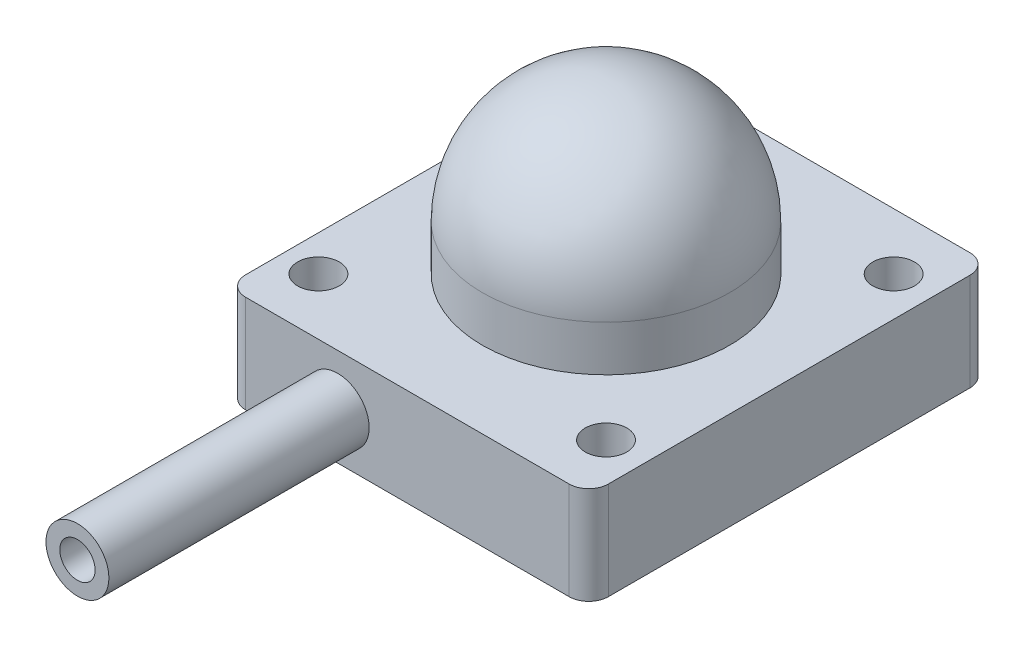
ISO-10303-21;
HEADER;
FILE_DESCRIPTION(('STEP AP214'),'2;1');
FILE_NAME('part.step','',(''),(''),'','','');
FILE_SCHEMA(('AUTOMOTIVE_DESIGN { 1 0 10303 214 1 1 1 1 }'));
ENDSEC;
DATA;
#1=APPLICATION_CONTEXT('core data for automotive mechanical design processes');
#2=APPLICATION_PROTOCOL_DEFINITION('international standard','automotive_design',2000,#1);
#3=PRODUCT_CONTEXT('',#1,'mechanical');
#4=PRODUCT('Part','Part','',(#3));
#5=PRODUCT_RELATED_PRODUCT_CATEGORY('part','',(#4));
#6=PRODUCT_DEFINITION_FORMATION('','',#4);
#7=PRODUCT_DEFINITION_CONTEXT('part definition',#1,'design');
#8=PRODUCT_DEFINITION('design','',#6,#7);
#9=PRODUCT_DEFINITION_SHAPE('','',#8);
#10=(LENGTH_UNIT() NAMED_UNIT(*) SI_UNIT(.MILLI.,.METRE.));
#11=(NAMED_UNIT(*) PLANE_ANGLE_UNIT() SI_UNIT($,.RADIAN.));
#12=(NAMED_UNIT(*) SI_UNIT($,.STERADIAN.) SOLID_ANGLE_UNIT());
#13=UNCERTAINTY_MEASURE_WITH_UNIT(LENGTH_MEASURE(1.E-05),#10,'distance_accuracy_value','');
#14=(GEOMETRIC_REPRESENTATION_CONTEXT(3) GLOBAL_UNCERTAINTY_ASSIGNED_CONTEXT((#13)) GLOBAL_UNIT_ASSIGNED_CONTEXT((#10,
#11,#12)) REPRESENTATION_CONTEXT('',''));
#15=CARTESIAN_POINT('',(0.,0.,0.));
#16=DIRECTION('',(0.,0.,1.));
#17=DIRECTION('',(1.,0.,0.));
#18=AXIS2_PLACEMENT_3D('',#15,#16,#17);
#19=CARTESIAN_POINT('',(0.,7.5,0.));
#20=DIRECTION('',(0.,-1.,0.));
#21=DIRECTION('',(0.,0.,-1.));
#22=AXIS2_PLACEMENT_3D('',#19,#20,#21);
#23=PLANE('',#22);
#24=CARTESIAN_POINT('',(0.,7.5,0.));
#25=DIRECTION('',(0.,1.,0.));
#26=DIRECTION('',(0.,0.,1.));
#27=AXIS2_PLACEMENT_3D('',#24,#25,#26);
#28=CIRCLE('',#27,9.5);
#29=CARTESIAN_POINT('',(0.,7.5,9.5));
#30=VERTEX_POINT('',#29);
#31=EDGE_CURVE('E160',#30,#30,#28,.T.);
#32=ORIENTED_EDGE('',*,*,#31,.F.);
#33=EDGE_LOOP('',(#32));
#34=FACE_BOUND('',#33,.T.);
#35=DIRECTION('',(-1.,0.,0.));
#36=VECTOR('',#35,1.);
#37=CARTESIAN_POINT('',(-13.7914684254667,7.5,-15.39627153565));
#38=LINE('',#37,#36);
#39=CARTESIAN_POINT('',(12.5689272987327,7.5,-15.39627153565));
#40=VERTEX_POINT('',#39);
#41=CARTESIAN_POINT('',(-12.2914684254667,7.5,-15.39627153565));
#42=VERTEX_POINT('',#41);
#43=EDGE_CURVE('E151',#40,#42,#38,.T.);
#44=ORIENTED_EDGE('',*,*,#43,.T.);
#45=CARTESIAN_POINT('',(-12.2914684254667,7.5,-13.89627153565));
#46=DIRECTION('',(0.,-1.,0.));
#47=DIRECTION('',(0.,0.,-1.));
#48=AXIS2_PLACEMENT_3D('',#45,#46,#47);
#49=CIRCLE('',#48,1.5);
#50=CARTESIAN_POINT('',(-13.7914684254667,7.5,-13.89627153565));
#51=VERTEX_POINT('',#50);
#52=EDGE_CURVE('E182',#42,#51,#49,.F.);
#53=ORIENTED_EDGE('',*,*,#52,.T.);
#54=DIRECTION('',(0.,0.,1.));
#55=VECTOR('',#54,1.);
#56=CARTESIAN_POINT('',(-13.7914684254667,7.5,15.39627153565));
#57=LINE('',#56,#55);
#58=CARTESIAN_POINT('',(-13.7914684254667,7.5,13.89627153565));
#59=VERTEX_POINT('',#58);
#60=EDGE_CURVE('E130',#51,#59,#57,.T.);
#61=ORIENTED_EDGE('',*,*,#60,.T.);
#62=CARTESIAN_POINT('',(-12.2914684254667,7.5,13.89627153565));
#63=DIRECTION('',(0.,-1.,0.));
#64=DIRECTION('',(0.,0.,-1.));
#65=AXIS2_PLACEMENT_3D('',#62,#63,#64);
#66=CIRCLE('',#65,1.5);
#67=CARTESIAN_POINT('',(-12.2914684254667,7.5,15.39627153565));
#68=VERTEX_POINT('',#67);
#69=EDGE_CURVE('E174',#59,#68,#66,.F.);
#70=ORIENTED_EDGE('',*,*,#69,.T.);
#71=DIRECTION('',(1.,0.,0.));
#72=VECTOR('',#71,1.);
#73=CARTESIAN_POINT('',(14.0689272987327,7.5,15.39627153565));
#74=LINE('',#73,#72);
#75=CARTESIAN_POINT('',(12.5689272987327,7.5,15.39627153565));
#76=VERTEX_POINT('',#75);
#77=EDGE_CURVE('E199',#68,#76,#74,.T.);
#78=ORIENTED_EDGE('',*,*,#77,.T.);
#79=CARTESIAN_POINT('',(12.5689272987327,7.5,13.89627153565));
#80=DIRECTION('',(0.,-1.,0.));
#81=DIRECTION('',(0.,0.,-1.));
#82=AXIS2_PLACEMENT_3D('',#79,#80,#81);
#83=CIRCLE('',#82,1.5);
#84=CARTESIAN_POINT('',(14.0689272987327,7.5,13.89627153565));
#85=VERTEX_POINT('',#84);
#86=EDGE_CURVE('E64',#76,#85,#83,.F.);
#87=ORIENTED_EDGE('',*,*,#86,.T.);
#88=DIRECTION('',(0.,0.,-1.));
#89=VECTOR('',#88,1.);
#90=CARTESIAN_POINT('',(14.0689272987327,7.5,-15.39627153565));
#91=LINE('',#90,#89);
#92=CARTESIAN_POINT('',(14.0689272987327,7.5,-13.89627153565));
#93=VERTEX_POINT('',#92);
#94=EDGE_CURVE('E206',#85,#93,#91,.T.);
#95=ORIENTED_EDGE('',*,*,#94,.T.);
#96=CARTESIAN_POINT('',(12.5689272987327,7.5,-13.89627153565));
#97=DIRECTION('',(0.,-1.,0.));
#98=DIRECTION('',(0.,0.,-1.));
#99=AXIS2_PLACEMENT_3D('',#96,#97,#98);
#100=CIRCLE('',#99,1.5);
#101=EDGE_CURVE('E179',#93,#40,#100,.F.);
#102=ORIENTED_EDGE('',*,*,#101,.T.);
#103=EDGE_LOOP('',(#44,#53,#61,#70,#78,#87,#95,#102));
#104=FACE_BOUND('',#103,.T.);
#105=CARTESIAN_POINT('',(-11.05,7.5,-11.05));
#106=DIRECTION('',(0.,1.,0.));
#107=DIRECTION('',(0.,0.,1.));
#108=AXIS2_PLACEMENT_3D('',#105,#106,#107);
#109=CIRCLE('',#108,1.6);
#110=CARTESIAN_POINT('',(-11.05,7.5,-9.44999999999999));
#111=VERTEX_POINT('',#110);
#112=EDGE_CURVE('E140',#111,#111,#109,.T.);
#113=ORIENTED_EDGE('',*,*,#112,.F.);
#114=EDGE_LOOP('',(#113));
#115=FACE_BOUND('',#114,.T.);
#116=CARTESIAN_POINT('',(11.05,7.5,-11.05));
#117=DIRECTION('',(0.,1.,0.));
#118=DIRECTION('',(0.,0.,1.));
#119=AXIS2_PLACEMENT_3D('',#116,#117,#118);
#120=CIRCLE('',#119,1.6);
#121=CARTESIAN_POINT('',(11.05,7.5,-9.44999999999999));
#122=VERTEX_POINT('',#121);
#123=EDGE_CURVE('E229',#122,#122,#120,.T.);
#124=ORIENTED_EDGE('',*,*,#123,.F.);
#125=EDGE_LOOP('',(#124));
#126=FACE_BOUND('',#125,.T.);
#127=CARTESIAN_POINT('',(-11.05,7.5,11.05));
#128=DIRECTION('',(0.,1.,0.));
#129=DIRECTION('',(0.,0.,-1.));
#130=AXIS2_PLACEMENT_3D('',#127,#128,#129);
#131=CIRCLE('',#130,1.6);
#132=CARTESIAN_POINT('',(-11.05,7.5,9.45));
#133=VERTEX_POINT('',#132);
#134=EDGE_CURVE('E235',#133,#133,#131,.T.);
#135=ORIENTED_EDGE('',*,*,#134,.F.);
#136=EDGE_LOOP('',(#135));
#137=FACE_BOUND('',#136,.T.);
#138=CARTESIAN_POINT('',(11.05,7.5,11.05));
#139=DIRECTION('',(0.,1.,0.));
#140=DIRECTION('',(0.,0.,-1.));
#141=AXIS2_PLACEMENT_3D('',#138,#139,#140);
#142=CIRCLE('',#141,1.6);
#143=CARTESIAN_POINT('',(11.05,7.5,9.44999999999999));
#144=VERTEX_POINT('',#143);
#145=EDGE_CURVE('E243',#144,#144,#142,.T.);
#146=ORIENTED_EDGE('',*,*,#145,.F.);
#147=EDGE_LOOP('',(#146));
#148=FACE_BOUND('',#147,.T.);
#149=ADVANCED_FACE('F41',(#34,#104,#115,#126,#137,#148),#23,.F.);
#150=CARTESIAN_POINT('',(0.,0.,0.));
#151=DIRECTION('',(0.,-1.,0.));
#152=DIRECTION('',(0.,0.,-1.));
#153=AXIS2_PLACEMENT_3D('',#150,#151,#152);
#154=PLANE('',#153);
#155=CARTESIAN_POINT('',(-11.05,0.,11.05));
#156=DIRECTION('',(0.,1.,0.));
#157=DIRECTION('',(0.,0.,-1.));
#158=AXIS2_PLACEMENT_3D('',#155,#156,#157);
#159=CIRCLE('',#158,1.6);
#160=CARTESIAN_POINT('',(-11.05,0.,9.45));
#161=VERTEX_POINT('',#160);
#162=EDGE_CURVE('E239',#161,#161,#159,.T.);
#163=ORIENTED_EDGE('',*,*,#162,.T.);
#164=EDGE_LOOP('',(#163));
#165=FACE_BOUND('',#164,.T.);
#166=CARTESIAN_POINT('',(-11.05,0.,-11.05));
#167=DIRECTION('',(0.,1.,0.));
#168=DIRECTION('',(0.,0.,1.));
#169=AXIS2_PLACEMENT_3D('',#166,#167,#168);
#170=CIRCLE('',#169,1.6);
#171=CARTESIAN_POINT('',(-11.05,0.,-9.44999999999999));
#172=VERTEX_POINT('',#171);
#173=EDGE_CURVE('E148',#172,#172,#170,.T.);
#174=ORIENTED_EDGE('',*,*,#173,.T.);
#175=EDGE_LOOP('',(#174));
#176=FACE_BOUND('',#175,.T.);
#177=DIRECTION('',(0.,0.,1.));
#178=VECTOR('',#177,1.);
#179=CARTESIAN_POINT('',(-13.7914684254667,0.,15.39627153565));
#180=LINE('',#179,#178);
#181=CARTESIAN_POINT('',(-13.7914684254667,0.,-13.89627153565));
#182=VERTEX_POINT('',#181);
#183=CARTESIAN_POINT('',(-13.7914684254667,0.,13.89627153565));
#184=VERTEX_POINT('',#183);
#185=EDGE_CURVE('E127',#182,#184,#180,.T.);
#186=ORIENTED_EDGE('',*,*,#185,.F.);
#187=CARTESIAN_POINT('',(-12.2914684254667,0.,-13.89627153565));
#188=DIRECTION('',(0.,-1.,0.));
#189=DIRECTION('',(0.,0.,-1.));
#190=AXIS2_PLACEMENT_3D('',#187,#188,#189);
#191=CIRCLE('',#190,1.5);
#192=CARTESIAN_POINT('',(-12.2914684254667,0.,-15.39627153565));
#193=VERTEX_POINT('',#192);
#194=EDGE_CURVE('E109',#182,#193,#191,.T.);
#195=ORIENTED_EDGE('',*,*,#194,.T.);
#196=DIRECTION('',(-1.,0.,0.));
#197=VECTOR('',#196,1.);
#198=CARTESIAN_POINT('',(-13.7914684254667,0.,-15.39627153565));
#199=LINE('',#198,#197);
#200=CARTESIAN_POINT('',(12.5689272987327,0.,-15.39627153565));
#201=VERTEX_POINT('',#200);
#202=EDGE_CURVE('E156',#201,#193,#199,.T.);
#203=ORIENTED_EDGE('',*,*,#202,.F.);
#204=CARTESIAN_POINT('',(12.5689272987327,0.,-13.89627153565));
#205=DIRECTION('',(0.,-1.,0.));
#206=DIRECTION('',(0.,0.,-1.));
#207=AXIS2_PLACEMENT_3D('',#204,#205,#206);
#208=CIRCLE('',#207,1.5);
#209=CARTESIAN_POINT('',(14.0689272987327,0.,-13.89627153565));
#210=VERTEX_POINT('',#209);
#211=EDGE_CURVE('E121',#201,#210,#208,.T.);
#212=ORIENTED_EDGE('',*,*,#211,.T.);
#213=DIRECTION('',(0.,0.,-1.));
#214=VECTOR('',#213,1.);
#215=CARTESIAN_POINT('',(14.0689272987327,0.,-15.39627153565));
#216=LINE('',#215,#214);
#217=CARTESIAN_POINT('',(14.0689272987327,0.,13.89627153565));
#218=VERTEX_POINT('',#217);
#219=EDGE_CURVE('E145',#218,#210,#216,.T.);
#220=ORIENTED_EDGE('',*,*,#219,.F.);
#221=CARTESIAN_POINT('',(12.5689272987327,0.,13.89627153565));
#222=DIRECTION('',(0.,-1.,0.));
#223=DIRECTION('',(0.,0.,-1.));
#224=AXIS2_PLACEMENT_3D('',#221,#222,#223);
#225=CIRCLE('',#224,1.5);
#226=CARTESIAN_POINT('',(12.5689272987327,0.,15.39627153565));
#227=VERTEX_POINT('',#226);
#228=EDGE_CURVE('E164',#218,#227,#225,.T.);
#229=ORIENTED_EDGE('',*,*,#228,.T.);
#230=DIRECTION('',(1.,0.,0.));
#231=VECTOR('',#230,1.);
#232=CARTESIAN_POINT('',(14.0689272987327,0.,15.39627153565));
#233=LINE('',#232,#231);
#234=CARTESIAN_POINT('',(-12.2914684254667,0.,15.39627153565));
#235=VERTEX_POINT('',#234);
#236=EDGE_CURVE('E139',#235,#227,#233,.T.);
#237=ORIENTED_EDGE('',*,*,#236,.F.);
#238=CARTESIAN_POINT('',(-12.2914684254667,0.,13.89627153565));
#239=DIRECTION('',(0.,-1.,0.));
#240=DIRECTION('',(0.,0.,-1.));
#241=AXIS2_PLACEMENT_3D('',#238,#239,#240);
#242=CIRCLE('',#241,1.5);
#243=EDGE_CURVE('E132',#235,#184,#242,.T.);
#244=ORIENTED_EDGE('',*,*,#243,.T.);
#245=EDGE_LOOP('',(#186,#195,#203,#212,#220,#229,#237,#244));
#246=FACE_BOUND('',#245,.T.);
#247=CARTESIAN_POINT('',(11.05,0.,-11.05));
#248=DIRECTION('',(0.,1.,0.));
#249=DIRECTION('',(0.,0.,1.));
#250=AXIS2_PLACEMENT_3D('',#247,#248,#249);
#251=CIRCLE('',#250,1.6);
#252=CARTESIAN_POINT('',(11.05,0.,-9.44999999999999));
#253=VERTEX_POINT('',#252);
#254=EDGE_CURVE('E231',#253,#253,#251,.T.);
#255=ORIENTED_EDGE('',*,*,#254,.T.);
#256=EDGE_LOOP('',(#255));
#257=FACE_BOUND('',#256,.T.);
#258=CARTESIAN_POINT('',(11.05,0.,11.05));
#259=DIRECTION('',(0.,1.,0.));
#260=DIRECTION('',(0.,0.,-1.));
#261=AXIS2_PLACEMENT_3D('',#258,#259,#260);
#262=CIRCLE('',#261,1.6);
#263=CARTESIAN_POINT('',(11.05,0.,9.44999999999999));
#264=VERTEX_POINT('',#263);
#265=EDGE_CURVE('E247',#264,#264,#262,.T.);
#266=ORIENTED_EDGE('',*,*,#265,.T.);
#267=EDGE_LOOP('',(#266));
#268=FACE_BOUND('',#267,.T.);
#269=ADVANCED_FACE('F135',(#165,#176,#246,#257,#268),#154,.T.);
#270=CARTESIAN_POINT('',(-13.7914684254667,7.5,15.39627153565));
#271=DIRECTION('',(1.,0.,0.));
#272=DIRECTION('',(0.,0.,-1.));
#273=AXIS2_PLACEMENT_3D('',#270,#271,#272);
#274=PLANE('',#273);
#275=ORIENTED_EDGE('',*,*,#60,.F.);
#276=DIRECTION('',(0.,-1.,0.));
#277=VECTOR('',#276,1.);
#278=CARTESIAN_POINT('',(-13.7914684254667,7.5,-13.89627153565));
#279=LINE('',#278,#277);
#280=EDGE_CURVE('E113',#51,#182,#279,.T.);
#281=ORIENTED_EDGE('',*,*,#280,.T.);
#282=ORIENTED_EDGE('',*,*,#185,.T.);
#283=DIRECTION('',(0.,-1.,0.));
#284=VECTOR('',#283,1.);
#285=CARTESIAN_POINT('',(-13.7914684254667,7.5,13.89627153565));
#286=LINE('',#285,#284);
#287=EDGE_CURVE('E133',#184,#59,#286,.F.);
#288=ORIENTED_EDGE('',*,*,#287,.T.);
#289=EDGE_LOOP('',(#275,#281,#282,#288));
#290=FACE_BOUND('',#289,.T.);
#291=ADVANCED_FACE('F126',(#290),#274,.F.);
#292=CARTESIAN_POINT('',(14.0689272987327,7.5,15.39627153565));
#293=DIRECTION('',(0.,0.,-1.));
#294=DIRECTION('',(-1.,0.,0.));
#295=AXIS2_PLACEMENT_3D('',#292,#293,#294);
#296=PLANE('',#295);
#297=CARTESIAN_POINT('',(-5.22021487495619,3.55937413603204,15.39627153565));
#298=DIRECTION('',(0.,0.,-1.));
#299=DIRECTION('',(-1.,0.,0.));
#300=AXIS2_PLACEMENT_3D('',#297,#298,#299);
#301=CIRCLE('',#300,2.41604738721611);
#302=CARTESIAN_POINT('',(-7.63626226217231,3.55937413603204,15.39627153565));
#303=VERTEX_POINT('',#302);
#304=EDGE_CURVE('E11',#303,#303,#301,.F.);
#305=ORIENTED_EDGE('',*,*,#304,.F.);
#306=EDGE_LOOP('',(#305));
#307=FACE_BOUND('',#306,.T.);
#308=ORIENTED_EDGE('',*,*,#236,.T.);
#309=DIRECTION('',(0.,-1.,0.));
#310=VECTOR('',#309,1.);
#311=CARTESIAN_POINT('',(12.5689272987327,7.5,15.39627153565));
#312=LINE('',#311,#310);
#313=EDGE_CURVE('E50',#227,#76,#312,.F.);
#314=ORIENTED_EDGE('',*,*,#313,.T.);
#315=ORIENTED_EDGE('',*,*,#77,.F.);
#316=DIRECTION('',(0.,-1.,0.));
#317=VECTOR('',#316,1.);
#318=CARTESIAN_POINT('',(-12.2914684254667,7.5,15.39627153565));
#319=LINE('',#318,#317);
#320=EDGE_CURVE('E191',#68,#235,#319,.T.);
#321=ORIENTED_EDGE('',*,*,#320,.T.);
#322=EDGE_LOOP('',(#308,#314,#315,#321));
#323=FACE_BOUND('',#322,.T.);
#324=ADVANCED_FACE('F198',(#307,#323),#296,.F.);
#325=CARTESIAN_POINT('',(14.0689272987327,7.5,-15.39627153565));
#326=DIRECTION('',(-1.,0.,0.));
#327=DIRECTION('',(0.,0.,1.));
#328=AXIS2_PLACEMENT_3D('',#325,#326,#327);
#329=PLANE('',#328);
#330=ORIENTED_EDGE('',*,*,#219,.T.);
#331=DIRECTION('',(0.,-1.,0.));
#332=VECTOR('',#331,1.);
#333=CARTESIAN_POINT('',(14.0689272987327,7.5,-13.89627153565));
#334=LINE('',#333,#332);
#335=EDGE_CURVE('E57',#210,#93,#334,.F.);
#336=ORIENTED_EDGE('',*,*,#335,.T.);
#337=ORIENTED_EDGE('',*,*,#94,.F.);
#338=DIRECTION('',(0.,-1.,0.));
#339=VECTOR('',#338,1.);
#340=CARTESIAN_POINT('',(14.0689272987327,7.5,13.89627153565));
#341=LINE('',#340,#339);
#342=EDGE_CURVE('E185',#85,#218,#341,.T.);
#343=ORIENTED_EDGE('',*,*,#342,.T.);
#344=EDGE_LOOP('',(#330,#336,#337,#343));
#345=FACE_BOUND('',#344,.T.);
#346=ADVANCED_FACE('F211',(#345),#329,.F.);
#347=CARTESIAN_POINT('',(-13.7914684254667,7.5,-15.39627153565));
#348=DIRECTION('',(0.,0.,1.));
#349=DIRECTION('',(1.,0.,0.));
#350=AXIS2_PLACEMENT_3D('',#347,#348,#349);
#351=PLANE('',#350);
#352=ORIENTED_EDGE('',*,*,#202,.T.);
#353=DIRECTION('',(0.,-1.,0.));
#354=VECTOR('',#353,1.);
#355=CARTESIAN_POINT('',(-12.2914684254667,7.5,-15.39627153565));
#356=LINE('',#355,#354);
#357=EDGE_CURVE('E114',#193,#42,#356,.F.);
#358=ORIENTED_EDGE('',*,*,#357,.T.);
#359=ORIENTED_EDGE('',*,*,#43,.F.);
#360=DIRECTION('',(0.,-1.,0.));
#361=VECTOR('',#360,1.);
#362=CARTESIAN_POINT('',(12.5689272987327,7.5,-15.39627153565));
#363=LINE('',#362,#361);
#364=EDGE_CURVE('E120',#40,#201,#363,.T.);
#365=ORIENTED_EDGE('',*,*,#364,.T.);
#366=EDGE_LOOP('',(#352,#358,#359,#365));
#367=FACE_BOUND('',#366,.T.);
#368=ADVANCED_FACE('F218',(#367),#351,.F.);
#369=CARTESIAN_POINT('',(-11.05,7.5,-11.05));
#370=DIRECTION('',(0.,-1.,0.));
#371=DIRECTION('',(0.,0.,-1.));
#372=AXIS2_PLACEMENT_3D('',#369,#370,#371);
#373=CYLINDRICAL_SURFACE('',#372,1.6);
#374=ORIENTED_EDGE('',*,*,#112,.T.);
#375=EDGE_LOOP('',(#374));
#376=FACE_BOUND('',#375,.T.);
#377=ORIENTED_EDGE('',*,*,#173,.F.);
#378=EDGE_LOOP('',(#377));
#379=FACE_BOUND('',#378,.T.);
#380=ADVANCED_FACE('F297',(#376,#379),#373,.F.);
#381=CARTESIAN_POINT('',(11.05,7.5,-11.05));
#382=DIRECTION('',(0.,-1.,0.));
#383=DIRECTION('',(0.,0.,-1.));
#384=AXIS2_PLACEMENT_3D('',#381,#382,#383);
#385=CYLINDRICAL_SURFACE('',#384,1.6);
#386=ORIENTED_EDGE('',*,*,#123,.T.);
#387=EDGE_LOOP('',(#386));
#388=FACE_BOUND('',#387,.T.);
#389=ORIENTED_EDGE('',*,*,#254,.F.);
#390=EDGE_LOOP('',(#389));
#391=FACE_BOUND('',#390,.T.);
#392=ADVANCED_FACE('F340',(#388,#391),#385,.F.);
#393=CARTESIAN_POINT('',(-11.05,7.5,11.05));
#394=DIRECTION('',(0.,-1.,0.));
#395=DIRECTION('',(0.,0.,-1.));
#396=AXIS2_PLACEMENT_3D('',#393,#394,#395);
#397=CYLINDRICAL_SURFACE('',#396,1.6);
#398=ORIENTED_EDGE('',*,*,#134,.T.);
#399=EDGE_LOOP('',(#398));
#400=FACE_BOUND('',#399,.T.);
#401=ORIENTED_EDGE('',*,*,#162,.F.);
#402=EDGE_LOOP('',(#401));
#403=FACE_BOUND('',#402,.T.);
#404=ADVANCED_FACE('F334',(#400,#403),#397,.F.);
#405=CARTESIAN_POINT('',(11.05,7.5,11.05));
#406=DIRECTION('',(0.,-1.,0.));
#407=DIRECTION('',(0.,0.,-1.));
#408=AXIS2_PLACEMENT_3D('',#405,#406,#407);
#409=CYLINDRICAL_SURFACE('',#408,1.6);
#410=ORIENTED_EDGE('',*,*,#145,.T.);
#411=EDGE_LOOP('',(#410));
#412=FACE_BOUND('',#411,.T.);
#413=ORIENTED_EDGE('',*,*,#265,.F.);
#414=EDGE_LOOP('',(#413));
#415=FACE_BOUND('',#414,.T.);
#416=ADVANCED_FACE('F339',(#412,#415),#409,.F.);
#417=CARTESIAN_POINT('',(0.,11.,0.));
#418=DIRECTION('',(0.,-1.,0.));
#419=DIRECTION('',(0.,0.,-1.));
#420=AXIS2_PLACEMENT_3D('',#417,#418,#419);
#421=CYLINDRICAL_SURFACE('',#420,9.5);
#422=CARTESIAN_POINT('',(0.,11.,0.));
#423=DIRECTION('',(0.,1.,0.));
#424=DIRECTION('',(0.,0.,1.));
#425=AXIS2_PLACEMENT_3D('',#422,#423,#424);
#426=CIRCLE('',#425,9.5);
#427=CARTESIAN_POINT('',(0.,11.,9.5));
#428=VERTEX_POINT('',#427);
#429=EDGE_CURVE('E251',#428,#428,#426,.T.);
#430=ORIENTED_EDGE('',*,*,#429,.F.);
#431=EDGE_LOOP('',(#430));
#432=FACE_BOUND('',#431,.T.);
#433=ORIENTED_EDGE('',*,*,#31,.T.);
#434=EDGE_LOOP('',(#433));
#435=FACE_BOUND('',#434,.T.);
#436=ADVANCED_FACE('F360',(#432,#435),#421,.T.);
#437=CARTESIAN_POINT('',(0.,11.,0.));
#438=DIRECTION('',(-1.,0.,0.));
#439=DIRECTION('',(0.,0.,1.));
#440=AXIS2_PLACEMENT_3D('',#437,#438,#439);
#441=SPHERICAL_SURFACE('',#440,9.5);
#442=CARTESIAN_POINT('',(0.,11.,0.));
#443=DIRECTION('',(0.,1.,0.));
#444=DIRECTION('',(0.,0.,1.));
#445=AXIS2_PLACEMENT_3D('',#442,#443,#444);
#446=SPHERICAL_SURFACE('',#445,9.5);
#447=ORIENTED_EDGE('',*,*,#429,.T.);
#448=EDGE_LOOP('',(#447));
#449=FACE_BOUND('',#448,.T.);
#450=ADVANCED_FACE('F312',(#449),#446,.T.);
#451=CARTESIAN_POINT('',(-12.2914684254667,7.5,-13.89627153565));
#452=DIRECTION('',(0.,-1.,0.));
#453=DIRECTION('',(0.,0.,-1.));
#454=AXIS2_PLACEMENT_3D('',#451,#452,#453);
#455=CYLINDRICAL_SURFACE('',#454,1.5);
#456=ORIENTED_EDGE('',*,*,#52,.F.);
#457=ORIENTED_EDGE('',*,*,#357,.F.);
#458=ORIENTED_EDGE('',*,*,#194,.F.);
#459=ORIENTED_EDGE('',*,*,#280,.F.);
#460=EDGE_LOOP('',(#456,#457,#458,#459));
#461=FACE_BOUND('',#460,.T.);
#462=ADVANCED_FACE('F112',(#461),#455,.T.);
#463=CARTESIAN_POINT('',(12.5689272987327,7.5,-13.89627153565));
#464=DIRECTION('',(0.,-1.,0.));
#465=DIRECTION('',(0.,0.,-1.));
#466=AXIS2_PLACEMENT_3D('',#463,#464,#465);
#467=CYLINDRICAL_SURFACE('',#466,1.5);
#468=ORIENTED_EDGE('',*,*,#101,.F.);
#469=ORIENTED_EDGE('',*,*,#335,.F.);
#470=ORIENTED_EDGE('',*,*,#211,.F.);
#471=ORIENTED_EDGE('',*,*,#364,.F.);
#472=EDGE_LOOP('',(#468,#469,#470,#471));
#473=FACE_BOUND('',#472,.T.);
#474=ADVANCED_FACE('F215',(#473),#467,.T.);
#475=CARTESIAN_POINT('',(12.5689272987327,7.5,13.89627153565));
#476=DIRECTION('',(0.,-1.,0.));
#477=DIRECTION('',(0.,0.,-1.));
#478=AXIS2_PLACEMENT_3D('',#475,#476,#477);
#479=CYLINDRICAL_SURFACE('',#478,1.5);
#480=ORIENTED_EDGE('',*,*,#86,.F.);
#481=ORIENTED_EDGE('',*,*,#313,.F.);
#482=ORIENTED_EDGE('',*,*,#228,.F.);
#483=ORIENTED_EDGE('',*,*,#342,.F.);
#484=EDGE_LOOP('',(#480,#481,#482,#483));
#485=FACE_BOUND('',#484,.T.);
#486=ADVANCED_FACE('F209',(#485),#479,.T.);
#487=CARTESIAN_POINT('',(-12.2914684254667,7.5,13.89627153565));
#488=DIRECTION('',(0.,-1.,0.));
#489=DIRECTION('',(0.,0.,-1.));
#490=AXIS2_PLACEMENT_3D('',#487,#488,#489);
#491=CYLINDRICAL_SURFACE('',#490,1.5);
#492=ORIENTED_EDGE('',*,*,#69,.F.);
#493=ORIENTED_EDGE('',*,*,#287,.F.);
#494=ORIENTED_EDGE('',*,*,#243,.F.);
#495=ORIENTED_EDGE('',*,*,#320,.F.);
#496=EDGE_LOOP('',(#492,#493,#494,#495));
#497=FACE_BOUND('',#496,.T.);
#498=ADVANCED_FACE('F43',(#497),#491,.T.);
#499=CARTESIAN_POINT('',(-5.22021487495619,3.55937413603204,35.39627153565));
#500=DIRECTION('',(0.,0.,1.));
#501=DIRECTION('',(1.,0.,0.));
#502=AXIS2_PLACEMENT_3D('',#499,#500,#501);
#503=PLANE('',#502);
#504=CARTESIAN_POINT('',(-5.22021487495619,3.55937413603204,35.39627153565));
#505=DIRECTION('',(0.,0.,1.));
#506=DIRECTION('',(1.,0.,0.));
#507=AXIS2_PLACEMENT_3D('',#504,#505,#506);
#508=CIRCLE('',#507,2.41604738721611);
#509=CARTESIAN_POINT('',(-2.80416748774008,3.55937413603204,35.39627153565));
#510=VERTEX_POINT('',#509);
#511=EDGE_CURVE('E258',#510,#510,#508,.T.);
#512=ORIENTED_EDGE('',*,*,#511,.T.);
#513=EDGE_LOOP('',(#512));
#514=FACE_BOUND('',#513,.T.);
#515=CARTESIAN_POINT('',(-5.22021487495619,3.55937413603204,35.39627153565));
#516=DIRECTION('',(0.,0.,1.));
#517=DIRECTION('',(1.,0.,0.));
#518=AXIS2_PLACEMENT_3D('',#515,#516,#517);
#519=CIRCLE('',#518,1.35843445920841);
#520=CARTESIAN_POINT('',(-3.86178041574778,3.55937413603204,35.39627153565));
#521=VERTEX_POINT('',#520);
#522=EDGE_CURVE('E262',#521,#521,#519,.T.);
#523=ORIENTED_EDGE('',*,*,#522,.F.);
#524=EDGE_LOOP('',(#523));
#525=FACE_BOUND('',#524,.T.);
#526=ADVANCED_FACE('F274',(#514,#525),#503,.T.);
#527=CARTESIAN_POINT('',(-5.22021487495619,3.55937413603204,35.39627153565));
#528=DIRECTION('',(0.,0.,-1.));
#529=DIRECTION('',(-1.,0.,0.));
#530=AXIS2_PLACEMENT_3D('',#527,#528,#529);
#531=CYLINDRICAL_SURFACE('',#530,2.41604738721611);
#532=ORIENTED_EDGE('',*,*,#511,.F.);
#533=EDGE_LOOP('',(#532));
#534=FACE_BOUND('',#533,.T.);
#535=ORIENTED_EDGE('',*,*,#304,.T.);
#536=EDGE_LOOP('',(#535));
#537=FACE_BOUND('',#536,.T.);
#538=ADVANCED_FACE('F276',(#534,#537),#531,.T.);
#539=CARTESIAN_POINT('',(-5.22021487495619,3.55937413603204,35.39627153565));
#540=DIRECTION('',(0.,0.,-1.));
#541=DIRECTION('',(-1.,0.,0.));
#542=AXIS2_PLACEMENT_3D('',#539,#540,#541);
#543=CYLINDRICAL_SURFACE('',#542,1.35843445920841);
#544=ORIENTED_EDGE('',*,*,#522,.T.);
#545=EDGE_LOOP('',(#544));
#546=FACE_BOUND('',#545,.T.);
#547=CARTESIAN_POINT('',(-5.22021487495619,3.55937413603204,15.39627153565));
#548=DIRECTION('',(0.,0.,1.));
#549=DIRECTION('',(1.,0.,0.));
#550=AXIS2_PLACEMENT_3D('',#547,#548,#549);
#551=CIRCLE('',#550,1.35843445920841);
#552=CARTESIAN_POINT('',(-3.86178041574778,3.55937413603204,15.39627153565));
#553=VERTEX_POINT('',#552);
#554=EDGE_CURVE('E263',#553,#553,#551,.T.);
#555=ORIENTED_EDGE('',*,*,#554,.F.);
#556=EDGE_LOOP('',(#555));
#557=FACE_BOUND('',#556,.T.);
#558=ADVANCED_FACE('F271',(#546,#557),#543,.F.);
#559=ORIENTED_EDGE('',*,*,#554,.T.);
#560=EDGE_LOOP('',(#559));
#561=FACE_BOUND('',#560,.T.);
#562=ADVANCED_FACE('F307',(#561),#296,.F.);
#563=CLOSED_SHELL('',(#149,#269,#291,#324,#346,#368,#380,#392,#404,#416,#436,#450,#462,#474,
#486,#498,#526,#538,#558,#562));
#564=MANIFOLD_SOLID_BREP('B2',#563);
#565=ADVANCED_BREP_SHAPE_REPRESENTATION('',(#18,#564),#14);
#566=SHAPE_DEFINITION_REPRESENTATION(#9,#565);
ENDSEC;
END-ISO-10303-21;
